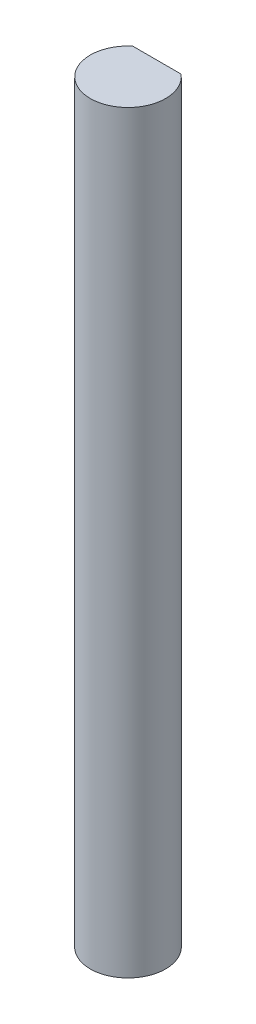
ISO-10303-21;
HEADER;
FILE_DESCRIPTION(('STEP AP214'),'2;1');
FILE_NAME('part.step','',(''),(''),'','','');
FILE_SCHEMA(('AUTOMOTIVE_DESIGN { 1 0 10303 214 1 1 1 1 }'));
ENDSEC;
DATA;
#1=APPLICATION_CONTEXT('core data for automotive mechanical design processes');
#2=APPLICATION_PROTOCOL_DEFINITION('international standard','automotive_design',2000,#1);
#3=PRODUCT_CONTEXT('',#1,'mechanical');
#4=PRODUCT('Part','Part','',(#3));
#5=PRODUCT_RELATED_PRODUCT_CATEGORY('part','',(#4));
#6=PRODUCT_DEFINITION_FORMATION('','',#4);
#7=PRODUCT_DEFINITION_CONTEXT('part definition',#1,'design');
#8=PRODUCT_DEFINITION('design','',#6,#7);
#9=PRODUCT_DEFINITION_SHAPE('','',#8);
#10=(LENGTH_UNIT() NAMED_UNIT(*) SI_UNIT(.MILLI.,.METRE.));
#11=(NAMED_UNIT(*) PLANE_ANGLE_UNIT() SI_UNIT($,.RADIAN.));
#12=(NAMED_UNIT(*) SI_UNIT($,.STERADIAN.) SOLID_ANGLE_UNIT());
#13=UNCERTAINTY_MEASURE_WITH_UNIT(LENGTH_MEASURE(1.E-05),#10,'distance_accuracy_value','');
#14=(GEOMETRIC_REPRESENTATION_CONTEXT(3) GLOBAL_UNCERTAINTY_ASSIGNED_CONTEXT((#13)) GLOBAL_UNIT_ASSIGNED_CONTEXT((#10,
#11,#12)) REPRESENTATION_CONTEXT('',''));
#15=CARTESIAN_POINT('',(0.,0.,0.));
#16=DIRECTION('',(0.,0.,1.));
#17=DIRECTION('',(1.,0.,0.));
#18=AXIS2_PLACEMENT_3D('',#15,#16,#17);
#19=CARTESIAN_POINT('',(0.,60.,0.));
#20=DIRECTION('',(0.,-1.,0.));
#21=DIRECTION('',(0.,0.,-1.));
#22=AXIS2_PLACEMENT_3D('',#19,#20,#21);
#23=CYLINDRICAL_SURFACE('',#22,3.);
#24=CARTESIAN_POINT('',(0.,60.,0.));
#25=DIRECTION('',(0.,1.,0.));
#26=DIRECTION('',(0.,0.,1.));
#27=AXIS2_PLACEMENT_3D('',#24,#25,#26);
#28=CIRCLE('',#27,3.);
#29=CARTESIAN_POINT('',(-1.92613602842582,60.,-2.3));
#30=VERTEX_POINT('',#29);
#31=CARTESIAN_POINT('',(1.92613602842582,60.,-2.3));
#32=VERTEX_POINT('',#31);
#33=EDGE_CURVE('E44',#30,#32,#28,.T.);
#34=ORIENTED_EDGE('',*,*,#33,.F.);
#35=DIRECTION('',(0.,-1.,0.));
#36=VECTOR('',#35,1.);
#37=CARTESIAN_POINT('',(-1.92613602842582,60.,-2.3));
#38=LINE('',#37,#36);
#39=CARTESIAN_POINT('',(-1.92613602842582,0.,-2.3));
#40=VERTEX_POINT('',#39);
#41=EDGE_CURVE('E58',#30,#40,#38,.T.);
#42=ORIENTED_EDGE('',*,*,#41,.T.);
#43=CARTESIAN_POINT('',(0.,0.,0.));
#44=DIRECTION('',(0.,1.,0.));
#45=DIRECTION('',(0.,0.,1.));
#46=AXIS2_PLACEMENT_3D('',#43,#44,#45);
#47=CIRCLE('',#46,3.);
#48=CARTESIAN_POINT('',(1.92613602842582,0.,-2.3));
#49=VERTEX_POINT('',#48);
#50=EDGE_CURVE('E66',#40,#49,#47,.T.);
#51=ORIENTED_EDGE('',*,*,#50,.T.);
#52=DIRECTION('',(0.,-1.,0.));
#53=VECTOR('',#52,1.);
#54=CARTESIAN_POINT('',(1.92613602842582,60.,-2.3));
#55=LINE('',#54,#53);
#56=EDGE_CURVE('E51',#49,#32,#55,.F.);
#57=ORIENTED_EDGE('',*,*,#56,.T.);
#58=EDGE_LOOP('',(#34,#42,#51,#57));
#59=FACE_BOUND('',#58,.T.);
#60=ADVANCED_FACE('F37',(#59),#23,.T.);
#61=CARTESIAN_POINT('',(0.,60.,0.));
#62=DIRECTION('',(0.,1.,0.));
#63=DIRECTION('',(0.,0.,1.));
#64=AXIS2_PLACEMENT_3D('',#61,#62,#63);
#65=PLANE('',#64);
#66=DIRECTION('',(1.,0.,0.));
#67=VECTOR('',#66,1.);
#68=CARTESIAN_POINT('',(-2.5,60.,-2.3));
#69=LINE('',#68,#67);
#70=EDGE_CURVE('E61',#30,#32,#69,.T.);
#71=ORIENTED_EDGE('',*,*,#70,.F.);
#72=ORIENTED_EDGE('',*,*,#33,.T.);
#73=EDGE_LOOP('',(#71,#72));
#74=FACE_BOUND('',#73,.T.);
#75=ADVANCED_FACE('F70',(#74),#65,.T.);
#76=CARTESIAN_POINT('',(0.,0.,0.));
#77=DIRECTION('',(0.,1.,0.));
#78=DIRECTION('',(0.,0.,1.));
#79=AXIS2_PLACEMENT_3D('',#76,#77,#78);
#80=PLANE('',#79);
#81=ORIENTED_EDGE('',*,*,#50,.F.);
#82=DIRECTION('',(1.,0.,0.));
#83=VECTOR('',#82,1.);
#84=CARTESIAN_POINT('',(0.,0.,-2.3));
#85=LINE('',#84,#83);
#86=EDGE_CURVE('E11',#40,#49,#85,.T.);
#87=ORIENTED_EDGE('',*,*,#86,.T.);
#88=EDGE_LOOP('',(#81,#87));
#89=FACE_BOUND('',#88,.T.);
#90=ADVANCED_FACE('F75',(#89),#80,.F.);
#91=CARTESIAN_POINT('',(-2.5,0.,-2.3));
#92=DIRECTION('',(0.,0.,1.));
#93=DIRECTION('',(1.,0.,0.));
#94=AXIS2_PLACEMENT_3D('',#91,#92,#93);
#95=PLANE('',#94);
#96=ORIENTED_EDGE('',*,*,#70,.T.);
#97=ORIENTED_EDGE('',*,*,#56,.F.);
#98=ORIENTED_EDGE('',*,*,#86,.F.);
#99=ORIENTED_EDGE('',*,*,#41,.F.);
#100=EDGE_LOOP('',(#96,#97,#98,#99));
#101=FACE_BOUND('',#100,.T.);
#102=ADVANCED_FACE('F60',(#101),#95,.F.);
#103=CLOSED_SHELL('',(#60,#75,#90,#102));
#104=MANIFOLD_SOLID_BREP('B2',#103);
#105=ADVANCED_BREP_SHAPE_REPRESENTATION('',(#18,#104),#14);
#106=SHAPE_DEFINITION_REPRESENTATION(#9,#105);
ENDSEC;
END-ISO-10303-21;
